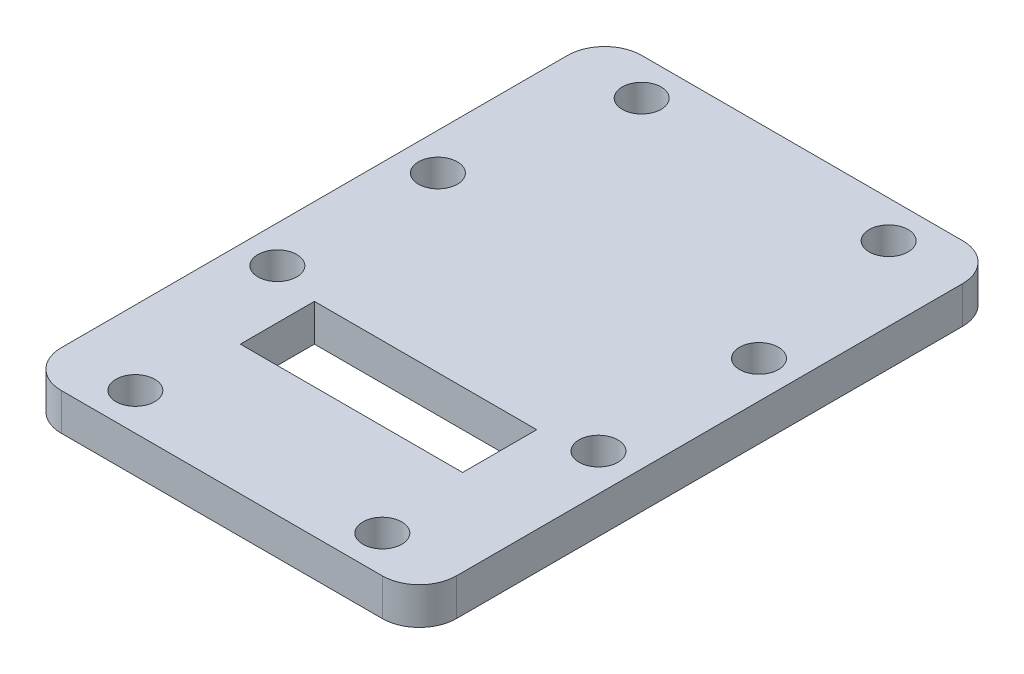
ISO-10303-21;
HEADER;
FILE_DESCRIPTION(('STEP AP214'),'2;1');
FILE_NAME('part.step','',(''),(''),'','','');
FILE_SCHEMA(('AUTOMOTIVE_DESIGN { 1 0 10303 214 1 1 1 1 }'));
ENDSEC;
DATA;
#1=APPLICATION_CONTEXT('core data for automotive mechanical design processes');
#2=APPLICATION_PROTOCOL_DEFINITION('international standard','automotive_design',2000,#1);
#3=PRODUCT_CONTEXT('',#1,'mechanical');
#4=PRODUCT('Part','Part','',(#3));
#5=PRODUCT_RELATED_PRODUCT_CATEGORY('part','',(#4));
#6=PRODUCT_DEFINITION_FORMATION('','',#4);
#7=PRODUCT_DEFINITION_CONTEXT('part definition',#1,'design');
#8=PRODUCT_DEFINITION('design','',#6,#7);
#9=PRODUCT_DEFINITION_SHAPE('','',#8);
#10=(LENGTH_UNIT() NAMED_UNIT(*) SI_UNIT(.MILLI.,.METRE.));
#11=(NAMED_UNIT(*) PLANE_ANGLE_UNIT() SI_UNIT($,.RADIAN.));
#12=(NAMED_UNIT(*) SI_UNIT($,.STERADIAN.) SOLID_ANGLE_UNIT());
#13=UNCERTAINTY_MEASURE_WITH_UNIT(LENGTH_MEASURE(1.E-05),#10,'distance_accuracy_value','');
#14=(GEOMETRIC_REPRESENTATION_CONTEXT(3) GLOBAL_UNCERTAINTY_ASSIGNED_CONTEXT((#13)) GLOBAL_UNIT_ASSIGNED_CONTEXT((#10,
#11,#12)) REPRESENTATION_CONTEXT('',''));
#15=CARTESIAN_POINT('',(0.,0.,0.));
#16=DIRECTION('',(0.,0.,1.));
#17=DIRECTION('',(1.,0.,0.));
#18=AXIS2_PLACEMENT_3D('',#15,#16,#17);
#19=CARTESIAN_POINT('',(-13.,15.,25.5));
#20=DIRECTION('',(0.,1.,0.));
#21=DIRECTION('',(0.,0.,1.));
#22=AXIS2_PLACEMENT_3D('',#19,#20,#21);
#23=PLANE('',#22);
#24=DIRECTION('',(1.,0.,0.));
#25=VECTOR('',#24,1.);
#26=CARTESIAN_POINT('',(-9.00000000000001,15.,18.));
#27=LINE('',#26,#25);
#28=CARTESIAN_POINT('',(-9.00000000000001,15.,18.));
#29=VERTEX_POINT('',#28);
#30=CARTESIAN_POINT('',(9.00000000000001,15.,18.));
#31=VERTEX_POINT('',#30);
#32=EDGE_CURVE('E143',#29,#31,#27,.T.);
#33=ORIENTED_EDGE('',*,*,#32,.F.);
#34=DIRECTION('',(0.,0.,1.));
#35=VECTOR('',#34,1.);
#36=CARTESIAN_POINT('',(-9.00000000000001,15.,12.));
#37=LINE('',#36,#35);
#38=CARTESIAN_POINT('',(-9.00000000000001,15.,12.));
#39=VERTEX_POINT('',#38);
#40=EDGE_CURVE('E127',#39,#29,#37,.T.);
#41=ORIENTED_EDGE('',*,*,#40,.F.);
#42=DIRECTION('',(-1.,0.,0.));
#43=VECTOR('',#42,1.);
#44=CARTESIAN_POINT('',(-9.00000000000001,15.,12.));
#45=LINE('',#44,#43);
#46=CARTESIAN_POINT('',(9.,15.,12.));
#47=VERTEX_POINT('',#46);
#48=EDGE_CURVE('E200',#47,#39,#45,.T.);
#49=ORIENTED_EDGE('',*,*,#48,.F.);
#50=DIRECTION('',(0.,0.,-1.));
#51=VECTOR('',#50,1.);
#52=CARTESIAN_POINT('',(9.,15.,12.));
#53=LINE('',#52,#51);
#54=EDGE_CURVE('E135',#31,#47,#53,.T.);
#55=ORIENTED_EDGE('',*,*,#54,.F.);
#56=EDGE_LOOP('',(#33,#41,#49,#55));
#57=FACE_BOUND('',#56,.T.);
#58=CARTESIAN_POINT('',(13.,15.,11.));
#59=DIRECTION('',(0.,1.,0.));
#60=DIRECTION('',(0.,0.,1.));
#61=AXIS2_PLACEMENT_3D('',#58,#59,#60);
#62=CIRCLE('',#61,1.575);
#63=CARTESIAN_POINT('',(13.,15.,12.575));
#64=VERTEX_POINT('',#63);
#65=EDGE_CURVE('E158',#64,#64,#62,.T.);
#66=ORIENTED_EDGE('',*,*,#65,.F.);
#67=EDGE_LOOP('',(#66));
#68=FACE_BOUND('',#67,.T.);
#69=CARTESIAN_POINT('',(10.,15.,-15.5));
#70=DIRECTION('',(0.,1.,0.));
#71=DIRECTION('',(0.,0.,1.));
#72=AXIS2_PLACEMENT_3D('',#69,#70,#71);
#73=CIRCLE('',#72,1.575);
#74=CARTESIAN_POINT('',(10.,15.,-13.925));
#75=VERTEX_POINT('',#74);
#76=EDGE_CURVE('E170',#75,#75,#73,.T.);
#77=ORIENTED_EDGE('',*,*,#76,.F.);
#78=EDGE_LOOP('',(#77));
#79=FACE_BOUND('',#78,.T.);
#80=CARTESIAN_POINT('',(-13.,15.,-2.));
#81=DIRECTION('',(0.,1.,0.));
#82=DIRECTION('',(0.,0.,1.));
#83=AXIS2_PLACEMENT_3D('',#80,#81,#82);
#84=CIRCLE('',#83,1.575);
#85=CARTESIAN_POINT('',(-13.,15.,-0.425000000000002));
#86=VERTEX_POINT('',#85);
#87=EDGE_CURVE('E182',#86,#86,#84,.T.);
#88=ORIENTED_EDGE('',*,*,#87,.F.);
#89=EDGE_LOOP('',(#88));
#90=FACE_BOUND('',#89,.T.);
#91=CARTESIAN_POINT('',(-10.,15.,25.5));
#92=DIRECTION('',(0.,1.,0.));
#93=DIRECTION('',(0.,0.,1.));
#94=AXIS2_PLACEMENT_3D('',#91,#92,#93);
#95=CIRCLE('',#94,1.575);
#96=CARTESIAN_POINT('',(-10.,15.,27.075));
#97=VERTEX_POINT('',#96);
#98=EDGE_CURVE('E194',#97,#97,#95,.T.);
#99=ORIENTED_EDGE('',*,*,#98,.F.);
#100=EDGE_LOOP('',(#99));
#101=FACE_BOUND('',#100,.T.);
#102=CARTESIAN_POINT('',(-13.,15.,25.5));
#103=DIRECTION('',(0.,1.,0.));
#104=DIRECTION('',(0.,0.,1.));
#105=AXIS2_PLACEMENT_3D('',#102,#103,#104);
#106=CIRCLE('',#105,3.);
#107=CARTESIAN_POINT('',(-16.,15.,25.5));
#108=VERTEX_POINT('',#107);
#109=CARTESIAN_POINT('',(-13.,15.,28.5));
#110=VERTEX_POINT('',#109);
#111=EDGE_CURVE('E211',#108,#110,#106,.T.);
#112=ORIENTED_EDGE('',*,*,#111,.T.);
#113=DIRECTION('',(1.,0.,0.));
#114=VECTOR('',#113,1.);
#115=CARTESIAN_POINT('',(-13.,15.,28.5));
#116=LINE('',#115,#114);
#117=CARTESIAN_POINT('',(13.,15.,28.5));
#118=VERTEX_POINT('',#117);
#119=EDGE_CURVE('E214',#110,#118,#116,.T.);
#120=ORIENTED_EDGE('',*,*,#119,.T.);
#121=CARTESIAN_POINT('',(13.,15.,25.5));
#122=DIRECTION('',(0.,1.,0.));
#123=DIRECTION('',(0.,0.,1.));
#124=AXIS2_PLACEMENT_3D('',#121,#122,#123);
#125=CIRCLE('',#124,3.);
#126=CARTESIAN_POINT('',(16.,15.,25.5));
#127=VERTEX_POINT('',#126);
#128=EDGE_CURVE('E217',#118,#127,#125,.T.);
#129=ORIENTED_EDGE('',*,*,#128,.T.);
#130=DIRECTION('',(0.,0.,-1.));
#131=VECTOR('',#130,1.);
#132=CARTESIAN_POINT('',(16.,15.,25.5));
#133=LINE('',#132,#131);
#134=CARTESIAN_POINT('',(16.,15.,-15.5));
#135=VERTEX_POINT('',#134);
#136=EDGE_CURVE('E219',#127,#135,#133,.T.);
#137=ORIENTED_EDGE('',*,*,#136,.T.);
#138=CARTESIAN_POINT('',(13.,15.,-15.5));
#139=DIRECTION('',(0.,1.,0.));
#140=DIRECTION('',(0.,0.,1.));
#141=AXIS2_PLACEMENT_3D('',#138,#139,#140);
#142=CIRCLE('',#141,3.);
#143=CARTESIAN_POINT('',(13.,15.,-18.5));
#144=VERTEX_POINT('',#143);
#145=EDGE_CURVE('E221',#135,#144,#142,.T.);
#146=ORIENTED_EDGE('',*,*,#145,.T.);
#147=DIRECTION('',(-1.,0.,0.));
#148=VECTOR('',#147,1.);
#149=CARTESIAN_POINT('',(13.,15.,-18.5));
#150=LINE('',#149,#148);
#151=CARTESIAN_POINT('',(-13.,15.,-18.5));
#152=VERTEX_POINT('',#151);
#153=EDGE_CURVE('E223',#144,#152,#150,.T.);
#154=ORIENTED_EDGE('',*,*,#153,.T.);
#155=CARTESIAN_POINT('',(-13.,15.,-15.5));
#156=DIRECTION('',(0.,1.,0.));
#157=DIRECTION('',(0.,0.,1.));
#158=AXIS2_PLACEMENT_3D('',#155,#156,#157);
#159=CIRCLE('',#158,3.);
#160=CARTESIAN_POINT('',(-16.,15.,-15.5));
#161=VERTEX_POINT('',#160);
#162=EDGE_CURVE('E225',#152,#161,#159,.T.);
#163=ORIENTED_EDGE('',*,*,#162,.T.);
#164=DIRECTION('',(0.,0.,1.));
#165=VECTOR('',#164,1.);
#166=CARTESIAN_POINT('',(-16.,15.,-15.5));
#167=LINE('',#166,#165);
#168=EDGE_CURVE('E227',#161,#108,#167,.T.);
#169=ORIENTED_EDGE('',*,*,#168,.T.);
#170=EDGE_LOOP('',(#112,#120,#129,#137,#146,#154,#163,#169));
#171=FACE_BOUND('',#170,.T.);
#172=CARTESIAN_POINT('',(-13.,15.,11.));
#173=DIRECTION('',(0.,1.,0.));
#174=DIRECTION('',(0.,0.,1.));
#175=AXIS2_PLACEMENT_3D('',#172,#173,#174);
#176=CIRCLE('',#175,1.575);
#177=CARTESIAN_POINT('',(-13.,15.,12.575));
#178=VERTEX_POINT('',#177);
#179=EDGE_CURVE('E188',#178,#178,#176,.T.);
#180=ORIENTED_EDGE('',*,*,#179,.F.);
#181=EDGE_LOOP('',(#180));
#182=FACE_BOUND('',#181,.T.);
#183=CARTESIAN_POINT('',(-9.99999999999999,15.,-15.5));
#184=DIRECTION('',(0.,1.,0.));
#185=DIRECTION('',(0.,0.,1.));
#186=AXIS2_PLACEMENT_3D('',#183,#184,#185);
#187=CIRCLE('',#186,1.575);
#188=CARTESIAN_POINT('',(-9.99999999999999,15.,-13.925));
#189=VERTEX_POINT('',#188);
#190=EDGE_CURVE('E176',#189,#189,#187,.T.);
#191=ORIENTED_EDGE('',*,*,#190,.F.);
#192=EDGE_LOOP('',(#191));
#193=FACE_BOUND('',#192,.T.);
#194=CARTESIAN_POINT('',(13.,15.,-2.));
#195=DIRECTION('',(0.,1.,0.));
#196=DIRECTION('',(0.,0.,1.));
#197=AXIS2_PLACEMENT_3D('',#194,#195,#196);
#198=CIRCLE('',#197,1.575);
#199=CARTESIAN_POINT('',(13.,15.,-0.424999999999999));
#200=VERTEX_POINT('',#199);
#201=EDGE_CURVE('E164',#200,#200,#198,.T.);
#202=ORIENTED_EDGE('',*,*,#201,.F.);
#203=EDGE_LOOP('',(#202));
#204=FACE_BOUND('',#203,.T.);
#205=CARTESIAN_POINT('',(10.,15.,25.5));
#206=DIRECTION('',(0.,1.,0.));
#207=DIRECTION('',(0.,0.,1.));
#208=AXIS2_PLACEMENT_3D('',#205,#206,#207);
#209=CIRCLE('',#208,1.575);
#210=CARTESIAN_POINT('',(10.,15.,27.075));
#211=VERTEX_POINT('',#210);
#212=EDGE_CURVE('E152',#211,#211,#209,.T.);
#213=ORIENTED_EDGE('',*,*,#212,.F.);
#214=EDGE_LOOP('',(#213));
#215=FACE_BOUND('',#214,.T.);
#216=ADVANCED_FACE('F39',(#57,#68,#79,#90,#101,#171,#182,#193,#204,#215),#23,.T.);
#217=CARTESIAN_POINT('',(-13.,12.,25.5));
#218=DIRECTION('',(0.,1.,0.));
#219=DIRECTION('',(0.,0.,1.));
#220=AXIS2_PLACEMENT_3D('',#217,#218,#219);
#221=PLANE('',#220);
#222=DIRECTION('',(0.,0.,1.));
#223=VECTOR('',#222,1.);
#224=CARTESIAN_POINT('',(-9.00000000000001,12.,12.));
#225=LINE('',#224,#223);
#226=CARTESIAN_POINT('',(-9.00000000000001,12.,12.));
#227=VERTEX_POINT('',#226);
#228=CARTESIAN_POINT('',(-9.00000000000001,12.,18.));
#229=VERTEX_POINT('',#228);
#230=EDGE_CURVE('E62',#227,#229,#225,.T.);
#231=ORIENTED_EDGE('',*,*,#230,.T.);
#232=DIRECTION('',(1.,0.,0.));
#233=VECTOR('',#232,1.);
#234=CARTESIAN_POINT('',(-13.,12.,18.));
#235=LINE('',#234,#233);
#236=CARTESIAN_POINT('',(9.00000000000001,12.,18.));
#237=VERTEX_POINT('',#236);
#238=EDGE_CURVE('E11',#229,#237,#235,.T.);
#239=ORIENTED_EDGE('',*,*,#238,.T.);
#240=DIRECTION('',(0.,0.,-1.));
#241=VECTOR('',#240,1.);
#242=CARTESIAN_POINT('',(9.,12.,12.));
#243=LINE('',#242,#241);
#244=CARTESIAN_POINT('',(9.,12.,12.));
#245=VERTEX_POINT('',#244);
#246=EDGE_CURVE('E203',#237,#245,#243,.T.);
#247=ORIENTED_EDGE('',*,*,#246,.T.);
#248=DIRECTION('',(-1.,0.,0.));
#249=VECTOR('',#248,1.);
#250=CARTESIAN_POINT('',(-9.00000000000001,12.,12.));
#251=LINE('',#250,#249);
#252=EDGE_CURVE('E136',#245,#227,#251,.T.);
#253=ORIENTED_EDGE('',*,*,#252,.T.);
#254=EDGE_LOOP('',(#231,#239,#247,#253));
#255=FACE_BOUND('',#254,.T.);
#256=CARTESIAN_POINT('',(-13.,12.,25.5));
#257=DIRECTION('',(0.,1.,0.));
#258=DIRECTION('',(0.,0.,1.));
#259=AXIS2_PLACEMENT_3D('',#256,#257,#258);
#260=CIRCLE('',#259,3.);
#261=CARTESIAN_POINT('',(-16.,12.,25.5));
#262=VERTEX_POINT('',#261);
#263=CARTESIAN_POINT('',(-13.,12.,28.5));
#264=VERTEX_POINT('',#263);
#265=EDGE_CURVE('E210',#262,#264,#260,.T.);
#266=ORIENTED_EDGE('',*,*,#265,.F.);
#267=DIRECTION('',(0.,0.,1.));
#268=VECTOR('',#267,1.);
#269=CARTESIAN_POINT('',(-16.,12.,-15.5));
#270=LINE('',#269,#268);
#271=CARTESIAN_POINT('',(-16.,12.,-15.5));
#272=VERTEX_POINT('',#271);
#273=EDGE_CURVE('E215',#272,#262,#270,.T.);
#274=ORIENTED_EDGE('',*,*,#273,.F.);
#275=CARTESIAN_POINT('',(-13.,12.,-15.5));
#276=DIRECTION('',(0.,1.,0.));
#277=DIRECTION('',(0.,0.,1.));
#278=AXIS2_PLACEMENT_3D('',#275,#276,#277);
#279=CIRCLE('',#278,3.);
#280=CARTESIAN_POINT('',(-13.,12.,-18.5));
#281=VERTEX_POINT('',#280);
#282=EDGE_CURVE('E242',#281,#272,#279,.T.);
#283=ORIENTED_EDGE('',*,*,#282,.F.);
#284=DIRECTION('',(-1.,0.,0.));
#285=VECTOR('',#284,1.);
#286=CARTESIAN_POINT('',(13.,12.,-18.5));
#287=LINE('',#286,#285);
#288=CARTESIAN_POINT('',(13.,12.,-18.5));
#289=VERTEX_POINT('',#288);
#290=EDGE_CURVE('E240',#289,#281,#287,.T.);
#291=ORIENTED_EDGE('',*,*,#290,.F.);
#292=CARTESIAN_POINT('',(13.,12.,-15.5));
#293=DIRECTION('',(0.,1.,0.));
#294=DIRECTION('',(0.,0.,1.));
#295=AXIS2_PLACEMENT_3D('',#292,#293,#294);
#296=CIRCLE('',#295,3.);
#297=CARTESIAN_POINT('',(16.,12.,-15.5));
#298=VERTEX_POINT('',#297);
#299=EDGE_CURVE('E238',#298,#289,#296,.T.);
#300=ORIENTED_EDGE('',*,*,#299,.F.);
#301=DIRECTION('',(0.,0.,-1.));
#302=VECTOR('',#301,1.);
#303=CARTESIAN_POINT('',(16.,12.,25.5));
#304=LINE('',#303,#302);
#305=CARTESIAN_POINT('',(16.,12.,25.5));
#306=VERTEX_POINT('',#305);
#307=EDGE_CURVE('E236',#306,#298,#304,.T.);
#308=ORIENTED_EDGE('',*,*,#307,.F.);
#309=CARTESIAN_POINT('',(13.,12.,25.5));
#310=DIRECTION('',(0.,1.,0.));
#311=DIRECTION('',(0.,0.,1.));
#312=AXIS2_PLACEMENT_3D('',#309,#310,#311);
#313=CIRCLE('',#312,3.);
#314=CARTESIAN_POINT('',(13.,12.,28.5));
#315=VERTEX_POINT('',#314);
#316=EDGE_CURVE('E234',#315,#306,#313,.T.);
#317=ORIENTED_EDGE('',*,*,#316,.F.);
#318=DIRECTION('',(1.,0.,0.));
#319=VECTOR('',#318,1.);
#320=CARTESIAN_POINT('',(-13.,12.,28.5));
#321=LINE('',#320,#319);
#322=EDGE_CURVE('E232',#264,#315,#321,.T.);
#323=ORIENTED_EDGE('',*,*,#322,.F.);
#324=EDGE_LOOP('',(#266,#274,#283,#291,#300,#308,#317,#323));
#325=FACE_BOUND('',#324,.T.);
#326=CARTESIAN_POINT('',(-10.,12.,25.5));
#327=DIRECTION('',(0.,1.,0.));
#328=DIRECTION('',(0.,0.,1.));
#329=AXIS2_PLACEMENT_3D('',#326,#327,#328);
#330=CIRCLE('',#329,1.575);
#331=CARTESIAN_POINT('',(-10.,12.,27.075));
#332=VERTEX_POINT('',#331);
#333=EDGE_CURVE('E191',#332,#332,#330,.T.);
#334=ORIENTED_EDGE('',*,*,#333,.T.);
#335=EDGE_LOOP('',(#334));
#336=FACE_BOUND('',#335,.T.);
#337=CARTESIAN_POINT('',(-13.,12.,11.));
#338=DIRECTION('',(0.,1.,0.));
#339=DIRECTION('',(0.,0.,1.));
#340=AXIS2_PLACEMENT_3D('',#337,#338,#339);
#341=CIRCLE('',#340,1.575);
#342=CARTESIAN_POINT('',(-13.,12.,12.575));
#343=VERTEX_POINT('',#342);
#344=EDGE_CURVE('E185',#343,#343,#341,.T.);
#345=ORIENTED_EDGE('',*,*,#344,.T.);
#346=EDGE_LOOP('',(#345));
#347=FACE_BOUND('',#346,.T.);
#348=CARTESIAN_POINT('',(-13.,12.,-2.));
#349=DIRECTION('',(0.,1.,0.));
#350=DIRECTION('',(0.,0.,1.));
#351=AXIS2_PLACEMENT_3D('',#348,#349,#350);
#352=CIRCLE('',#351,1.575);
#353=CARTESIAN_POINT('',(-13.,12.,-0.425000000000002));
#354=VERTEX_POINT('',#353);
#355=EDGE_CURVE('E179',#354,#354,#352,.T.);
#356=ORIENTED_EDGE('',*,*,#355,.T.);
#357=EDGE_LOOP('',(#356));
#358=FACE_BOUND('',#357,.T.);
#359=CARTESIAN_POINT('',(-9.99999999999999,12.,-15.5));
#360=DIRECTION('',(0.,1.,0.));
#361=DIRECTION('',(0.,0.,1.));
#362=AXIS2_PLACEMENT_3D('',#359,#360,#361);
#363=CIRCLE('',#362,1.575);
#364=CARTESIAN_POINT('',(-9.99999999999999,12.,-13.925));
#365=VERTEX_POINT('',#364);
#366=EDGE_CURVE('E173',#365,#365,#363,.T.);
#367=ORIENTED_EDGE('',*,*,#366,.T.);
#368=EDGE_LOOP('',(#367));
#369=FACE_BOUND('',#368,.T.);
#370=CARTESIAN_POINT('',(10.,12.,-15.5));
#371=DIRECTION('',(0.,1.,0.));
#372=DIRECTION('',(0.,0.,1.));
#373=AXIS2_PLACEMENT_3D('',#370,#371,#372);
#374=CIRCLE('',#373,1.575);
#375=CARTESIAN_POINT('',(10.,12.,-13.925));
#376=VERTEX_POINT('',#375);
#377=EDGE_CURVE('E167',#376,#376,#374,.T.);
#378=ORIENTED_EDGE('',*,*,#377,.T.);
#379=EDGE_LOOP('',(#378));
#380=FACE_BOUND('',#379,.T.);
#381=CARTESIAN_POINT('',(13.,12.,-2.));
#382=DIRECTION('',(0.,1.,0.));
#383=DIRECTION('',(0.,0.,1.));
#384=AXIS2_PLACEMENT_3D('',#381,#382,#383);
#385=CIRCLE('',#384,1.575);
#386=CARTESIAN_POINT('',(13.,12.,-0.424999999999999));
#387=VERTEX_POINT('',#386);
#388=EDGE_CURVE('E161',#387,#387,#385,.T.);
#389=ORIENTED_EDGE('',*,*,#388,.T.);
#390=EDGE_LOOP('',(#389));
#391=FACE_BOUND('',#390,.T.);
#392=CARTESIAN_POINT('',(13.,12.,11.));
#393=DIRECTION('',(0.,1.,0.));
#394=DIRECTION('',(0.,0.,1.));
#395=AXIS2_PLACEMENT_3D('',#392,#393,#394);
#396=CIRCLE('',#395,1.575);
#397=CARTESIAN_POINT('',(13.,12.,12.575));
#398=VERTEX_POINT('',#397);
#399=EDGE_CURVE('E155',#398,#398,#396,.T.);
#400=ORIENTED_EDGE('',*,*,#399,.T.);
#401=EDGE_LOOP('',(#400));
#402=FACE_BOUND('',#401,.T.);
#403=CARTESIAN_POINT('',(10.,12.,25.5));
#404=DIRECTION('',(0.,1.,0.));
#405=DIRECTION('',(0.,0.,1.));
#406=AXIS2_PLACEMENT_3D('',#403,#404,#405);
#407=CIRCLE('',#406,1.575);
#408=CARTESIAN_POINT('',(10.,12.,27.075));
#409=VERTEX_POINT('',#408);
#410=EDGE_CURVE('E150',#409,#409,#407,.T.);
#411=ORIENTED_EDGE('',*,*,#410,.T.);
#412=EDGE_LOOP('',(#411));
#413=FACE_BOUND('',#412,.T.);
#414=ADVANCED_FACE('F275',(#255,#325,#336,#347,#358,#369,#380,#391,#402,#413),#221,.F.);
#415=CARTESIAN_POINT('',(-13.,15.,25.5));
#416=DIRECTION('',(0.,-1.,0.));
#417=DIRECTION('',(0.,0.,-1.));
#418=AXIS2_PLACEMENT_3D('',#415,#416,#417);
#419=CYLINDRICAL_SURFACE('',#418,3.);
#420=ORIENTED_EDGE('',*,*,#265,.T.);
#421=DIRECTION('',(0.,-1.,0.));
#422=VECTOR('',#421,1.);
#423=CARTESIAN_POINT('',(-13.,15.,28.5));
#424=LINE('',#423,#422);
#425=EDGE_CURVE('E47',#110,#264,#424,.T.);
#426=ORIENTED_EDGE('',*,*,#425,.F.);
#427=ORIENTED_EDGE('',*,*,#111,.F.);
#428=DIRECTION('',(0.,-1.,0.));
#429=VECTOR('',#428,1.);
#430=CARTESIAN_POINT('',(-16.,15.,25.5));
#431=LINE('',#430,#429);
#432=EDGE_CURVE('E229',#108,#262,#431,.T.);
#433=ORIENTED_EDGE('',*,*,#432,.T.);
#434=EDGE_LOOP('',(#420,#426,#427,#433));
#435=FACE_BOUND('',#434,.T.);
#436=ADVANCED_FACE('F41',(#435),#419,.T.);
#437=CARTESIAN_POINT('',(-13.,15.,28.5));
#438=DIRECTION('',(0.,0.,-1.));
#439=DIRECTION('',(-1.,0.,0.));
#440=AXIS2_PLACEMENT_3D('',#437,#438,#439);
#441=PLANE('',#440);
#442=ORIENTED_EDGE('',*,*,#322,.T.);
#443=DIRECTION('',(0.,-1.,0.));
#444=VECTOR('',#443,1.);
#445=CARTESIAN_POINT('',(13.,15.,28.5));
#446=LINE('',#445,#444);
#447=EDGE_CURVE('E262',#118,#315,#446,.T.);
#448=ORIENTED_EDGE('',*,*,#447,.F.);
#449=ORIENTED_EDGE('',*,*,#119,.F.);
#450=ORIENTED_EDGE('',*,*,#425,.T.);
#451=EDGE_LOOP('',(#442,#448,#449,#450));
#452=FACE_BOUND('',#451,.T.);
#453=ADVANCED_FACE('F267',(#452),#441,.F.);
#454=CARTESIAN_POINT('',(13.,15.,25.5));
#455=DIRECTION('',(0.,-1.,0.));
#456=DIRECTION('',(0.,0.,-1.));
#457=AXIS2_PLACEMENT_3D('',#454,#455,#456);
#458=CYLINDRICAL_SURFACE('',#457,3.);
#459=ORIENTED_EDGE('',*,*,#316,.T.);
#460=DIRECTION('',(0.,-1.,0.));
#461=VECTOR('',#460,1.);
#462=CARTESIAN_POINT('',(16.,15.,25.5));
#463=LINE('',#462,#461);
#464=EDGE_CURVE('E259',#127,#306,#463,.T.);
#465=ORIENTED_EDGE('',*,*,#464,.F.);
#466=ORIENTED_EDGE('',*,*,#128,.F.);
#467=ORIENTED_EDGE('',*,*,#447,.T.);
#468=EDGE_LOOP('',(#459,#465,#466,#467));
#469=FACE_BOUND('',#468,.T.);
#470=ADVANCED_FACE('F283',(#469),#458,.T.);
#471=CARTESIAN_POINT('',(16.,15.,25.5));
#472=DIRECTION('',(-1.,0.,0.));
#473=DIRECTION('',(0.,0.,1.));
#474=AXIS2_PLACEMENT_3D('',#471,#472,#473);
#475=PLANE('',#474);
#476=ORIENTED_EDGE('',*,*,#307,.T.);
#477=DIRECTION('',(0.,-1.,0.));
#478=VECTOR('',#477,1.);
#479=CARTESIAN_POINT('',(16.,15.,-15.5));
#480=LINE('',#479,#478);
#481=EDGE_CURVE('E256',#135,#298,#480,.T.);
#482=ORIENTED_EDGE('',*,*,#481,.F.);
#483=ORIENTED_EDGE('',*,*,#136,.F.);
#484=ORIENTED_EDGE('',*,*,#464,.T.);
#485=EDGE_LOOP('',(#476,#482,#483,#484));
#486=FACE_BOUND('',#485,.T.);
#487=ADVANCED_FACE('F287',(#486),#475,.F.);
#488=CARTESIAN_POINT('',(13.,15.,-15.5));
#489=DIRECTION('',(0.,-1.,0.));
#490=DIRECTION('',(0.,0.,-1.));
#491=AXIS2_PLACEMENT_3D('',#488,#489,#490);
#492=CYLINDRICAL_SURFACE('',#491,3.);
#493=ORIENTED_EDGE('',*,*,#299,.T.);
#494=DIRECTION('',(0.,-1.,0.));
#495=VECTOR('',#494,1.);
#496=CARTESIAN_POINT('',(13.,15.,-18.5));
#497=LINE('',#496,#495);
#498=EDGE_CURVE('E253',#144,#289,#497,.T.);
#499=ORIENTED_EDGE('',*,*,#498,.F.);
#500=ORIENTED_EDGE('',*,*,#145,.F.);
#501=ORIENTED_EDGE('',*,*,#481,.T.);
#502=EDGE_LOOP('',(#493,#499,#500,#501));
#503=FACE_BOUND('',#502,.T.);
#504=ADVANCED_FACE('F306',(#503),#492,.T.);
#505=CARTESIAN_POINT('',(13.,15.,-18.5));
#506=DIRECTION('',(0.,0.,1.));
#507=DIRECTION('',(1.,0.,0.));
#508=AXIS2_PLACEMENT_3D('',#505,#506,#507);
#509=PLANE('',#508);
#510=ORIENTED_EDGE('',*,*,#290,.T.);
#511=DIRECTION('',(0.,-1.,0.));
#512=VECTOR('',#511,1.);
#513=CARTESIAN_POINT('',(-13.,15.,-18.5));
#514=LINE('',#513,#512);
#515=EDGE_CURVE('E250',#152,#281,#514,.T.);
#516=ORIENTED_EDGE('',*,*,#515,.F.);
#517=ORIENTED_EDGE('',*,*,#153,.F.);
#518=ORIENTED_EDGE('',*,*,#498,.T.);
#519=EDGE_LOOP('',(#510,#516,#517,#518));
#520=FACE_BOUND('',#519,.T.);
#521=ADVANCED_FACE('F303',(#520),#509,.F.);
#522=CARTESIAN_POINT('',(-13.,15.,-15.5));
#523=DIRECTION('',(0.,-1.,0.));
#524=DIRECTION('',(0.,0.,-1.));
#525=AXIS2_PLACEMENT_3D('',#522,#523,#524);
#526=CYLINDRICAL_SURFACE('',#525,3.);
#527=ORIENTED_EDGE('',*,*,#282,.T.);
#528=DIRECTION('',(0.,-1.,0.));
#529=VECTOR('',#528,1.);
#530=CARTESIAN_POINT('',(-16.,15.,-15.5));
#531=LINE('',#530,#529);
#532=EDGE_CURVE('E247',#161,#272,#531,.T.);
#533=ORIENTED_EDGE('',*,*,#532,.F.);
#534=ORIENTED_EDGE('',*,*,#162,.F.);
#535=ORIENTED_EDGE('',*,*,#515,.T.);
#536=EDGE_LOOP('',(#527,#533,#534,#535));
#537=FACE_BOUND('',#536,.T.);
#538=ADVANCED_FACE('F299',(#537),#526,.T.);
#539=CARTESIAN_POINT('',(-16.,15.,-15.5));
#540=DIRECTION('',(1.,0.,0.));
#541=DIRECTION('',(0.,0.,-1.));
#542=AXIS2_PLACEMENT_3D('',#539,#540,#541);
#543=PLANE('',#542);
#544=ORIENTED_EDGE('',*,*,#273,.T.);
#545=ORIENTED_EDGE('',*,*,#432,.F.);
#546=ORIENTED_EDGE('',*,*,#168,.F.);
#547=ORIENTED_EDGE('',*,*,#532,.T.);
#548=EDGE_LOOP('',(#544,#545,#546,#547));
#549=FACE_BOUND('',#548,.T.);
#550=ADVANCED_FACE('F297',(#549),#543,.F.);
#551=CARTESIAN_POINT('',(-9.00000000000001,15.,12.));
#552=DIRECTION('',(1.,0.,0.));
#553=DIRECTION('',(0.,0.,-1.));
#554=AXIS2_PLACEMENT_3D('',#551,#552,#553);
#555=PLANE('',#554);
#556=ORIENTED_EDGE('',*,*,#230,.F.);
#557=DIRECTION('',(0.,-1.,0.));
#558=VECTOR('',#557,1.);
#559=CARTESIAN_POINT('',(-9.00000000000001,15.,12.));
#560=LINE('',#559,#558);
#561=EDGE_CURVE('E131',#39,#227,#560,.T.);
#562=ORIENTED_EDGE('',*,*,#561,.F.);
#563=ORIENTED_EDGE('',*,*,#40,.T.);
#564=DIRECTION('',(0.,1.,0.));
#565=VECTOR('',#564,1.);
#566=CARTESIAN_POINT('',(-9.00000000000001,10.,18.));
#567=LINE('',#566,#565);
#568=EDGE_CURVE('E130',#229,#29,#567,.T.);
#569=ORIENTED_EDGE('',*,*,#568,.F.);
#570=EDGE_LOOP('',(#556,#562,#563,#569));
#571=FACE_BOUND('',#570,.T.);
#572=ADVANCED_FACE('F129',(#571),#555,.T.);
#573=CARTESIAN_POINT('',(9.,15.,12.));
#574=DIRECTION('',(-1.,0.,0.));
#575=DIRECTION('',(0.,0.,1.));
#576=AXIS2_PLACEMENT_3D('',#573,#574,#575);
#577=PLANE('',#576);
#578=ORIENTED_EDGE('',*,*,#246,.F.);
#579=DIRECTION('',(0.,1.,0.));
#580=VECTOR('',#579,1.);
#581=CARTESIAN_POINT('',(9.00000000000001,10.,18.));
#582=LINE('',#581,#580);
#583=EDGE_CURVE('E144',#237,#31,#582,.T.);
#584=ORIENTED_EDGE('',*,*,#583,.T.);
#585=ORIENTED_EDGE('',*,*,#54,.T.);
#586=DIRECTION('',(0.,-1.,0.));
#587=VECTOR('',#586,1.);
#588=CARTESIAN_POINT('',(9.,15.,12.));
#589=LINE('',#588,#587);
#590=EDGE_CURVE('E54',#47,#245,#589,.T.);
#591=ORIENTED_EDGE('',*,*,#590,.T.);
#592=EDGE_LOOP('',(#578,#584,#585,#591));
#593=FACE_BOUND('',#592,.T.);
#594=ADVANCED_FACE('F349',(#593),#577,.T.);
#595=CARTESIAN_POINT('',(-9.00000000000001,15.,12.));
#596=DIRECTION('',(0.,0.,1.));
#597=DIRECTION('',(1.,0.,0.));
#598=AXIS2_PLACEMENT_3D('',#595,#596,#597);
#599=PLANE('',#598);
#600=ORIENTED_EDGE('',*,*,#252,.F.);
#601=ORIENTED_EDGE('',*,*,#590,.F.);
#602=ORIENTED_EDGE('',*,*,#48,.T.);
#603=ORIENTED_EDGE('',*,*,#561,.T.);
#604=EDGE_LOOP('',(#600,#601,#602,#603));
#605=FACE_BOUND('',#604,.T.);
#606=ADVANCED_FACE('F359',(#605),#599,.T.);
#607=CARTESIAN_POINT('',(-10.,15.,25.5));
#608=DIRECTION('',(0.,-1.,0.));
#609=DIRECTION('',(0.,0.,-1.));
#610=AXIS2_PLACEMENT_3D('',#607,#608,#609);
#611=CYLINDRICAL_SURFACE('',#610,1.575);
#612=ORIENTED_EDGE('',*,*,#98,.T.);
#613=EDGE_LOOP('',(#612));
#614=FACE_BOUND('',#613,.T.);
#615=ORIENTED_EDGE('',*,*,#333,.F.);
#616=EDGE_LOOP('',(#615));
#617=FACE_BOUND('',#616,.T.);
#618=ADVANCED_FACE('F370',(#614,#617),#611,.F.);
#619=CARTESIAN_POINT('',(-13.,15.,11.));
#620=DIRECTION('',(0.,-1.,0.));
#621=DIRECTION('',(0.,0.,-1.));
#622=AXIS2_PLACEMENT_3D('',#619,#620,#621);
#623=CYLINDRICAL_SURFACE('',#622,1.575);
#624=ORIENTED_EDGE('',*,*,#179,.T.);
#625=EDGE_LOOP('',(#624));
#626=FACE_BOUND('',#625,.T.);
#627=ORIENTED_EDGE('',*,*,#344,.F.);
#628=EDGE_LOOP('',(#627));
#629=FACE_BOUND('',#628,.T.);
#630=ADVANCED_FACE('F378',(#626,#629),#623,.F.);
#631=CARTESIAN_POINT('',(-13.,15.,-2.));
#632=DIRECTION('',(0.,-1.,0.));
#633=DIRECTION('',(0.,0.,-1.));
#634=AXIS2_PLACEMENT_3D('',#631,#632,#633);
#635=CYLINDRICAL_SURFACE('',#634,1.575);
#636=ORIENTED_EDGE('',*,*,#87,.T.);
#637=EDGE_LOOP('',(#636));
#638=FACE_BOUND('',#637,.T.);
#639=ORIENTED_EDGE('',*,*,#355,.F.);
#640=EDGE_LOOP('',(#639));
#641=FACE_BOUND('',#640,.T.);
#642=ADVANCED_FACE('F387',(#638,#641),#635,.F.);
#643=CARTESIAN_POINT('',(-9.99999999999999,15.,-15.5));
#644=DIRECTION('',(0.,-1.,0.));
#645=DIRECTION('',(0.,0.,-1.));
#646=AXIS2_PLACEMENT_3D('',#643,#644,#645);
#647=CYLINDRICAL_SURFACE('',#646,1.575);
#648=ORIENTED_EDGE('',*,*,#190,.T.);
#649=EDGE_LOOP('',(#648));
#650=FACE_BOUND('',#649,.T.);
#651=ORIENTED_EDGE('',*,*,#366,.F.);
#652=EDGE_LOOP('',(#651));
#653=FACE_BOUND('',#652,.T.);
#654=ADVANCED_FACE('F396',(#650,#653),#647,.F.);
#655=CARTESIAN_POINT('',(10.,15.,-15.5));
#656=DIRECTION('',(0.,-1.,0.));
#657=DIRECTION('',(0.,0.,-1.));
#658=AXIS2_PLACEMENT_3D('',#655,#656,#657);
#659=CYLINDRICAL_SURFACE('',#658,1.575);
#660=ORIENTED_EDGE('',*,*,#76,.T.);
#661=EDGE_LOOP('',(#660));
#662=FACE_BOUND('',#661,.T.);
#663=ORIENTED_EDGE('',*,*,#377,.F.);
#664=EDGE_LOOP('',(#663));
#665=FACE_BOUND('',#664,.T.);
#666=ADVANCED_FACE('F405',(#662,#665),#659,.F.);
#667=CARTESIAN_POINT('',(13.,15.,-2.));
#668=DIRECTION('',(0.,-1.,0.));
#669=DIRECTION('',(0.,0.,-1.));
#670=AXIS2_PLACEMENT_3D('',#667,#668,#669);
#671=CYLINDRICAL_SURFACE('',#670,1.575);
#672=ORIENTED_EDGE('',*,*,#201,.T.);
#673=EDGE_LOOP('',(#672));
#674=FACE_BOUND('',#673,.T.);
#675=ORIENTED_EDGE('',*,*,#388,.F.);
#676=EDGE_LOOP('',(#675));
#677=FACE_BOUND('',#676,.T.);
#678=ADVANCED_FACE('F414',(#674,#677),#671,.F.);
#679=CARTESIAN_POINT('',(13.,15.,11.));
#680=DIRECTION('',(0.,-1.,0.));
#681=DIRECTION('',(0.,0.,-1.));
#682=AXIS2_PLACEMENT_3D('',#679,#680,#681);
#683=CYLINDRICAL_SURFACE('',#682,1.575);
#684=ORIENTED_EDGE('',*,*,#65,.T.);
#685=EDGE_LOOP('',(#684));
#686=FACE_BOUND('',#685,.T.);
#687=ORIENTED_EDGE('',*,*,#399,.F.);
#688=EDGE_LOOP('',(#687));
#689=FACE_BOUND('',#688,.T.);
#690=ADVANCED_FACE('F423',(#686,#689),#683,.F.);
#691=CARTESIAN_POINT('',(10.,15.,25.5));
#692=DIRECTION('',(0.,-1.,0.));
#693=DIRECTION('',(0.,0.,-1.));
#694=AXIS2_PLACEMENT_3D('',#691,#692,#693);
#695=CYLINDRICAL_SURFACE('',#694,1.575);
#696=ORIENTED_EDGE('',*,*,#212,.T.);
#697=EDGE_LOOP('',(#696));
#698=FACE_BOUND('',#697,.T.);
#699=ORIENTED_EDGE('',*,*,#410,.F.);
#700=EDGE_LOOP('',(#699));
#701=FACE_BOUND('',#700,.T.);
#702=ADVANCED_FACE('F432',(#698,#701),#695,.F.);
#703=CARTESIAN_POINT('',(-9.00000000000001,10.,18.));
#704=DIRECTION('',(0.,0.,1.));
#705=DIRECTION('',(1.,0.,0.));
#706=AXIS2_PLACEMENT_3D('',#703,#704,#705);
#707=PLANE('',#706);
#708=ORIENTED_EDGE('',*,*,#568,.T.);
#709=ORIENTED_EDGE('',*,*,#32,.T.);
#710=ORIENTED_EDGE('',*,*,#583,.F.);
#711=ORIENTED_EDGE('',*,*,#238,.F.);
#712=EDGE_LOOP('',(#708,#709,#710,#711));
#713=FACE_BOUND('',#712,.T.);
#714=ADVANCED_FACE('F141',(#713),#707,.F.);
#715=CLOSED_SHELL('',(#216,#414,#436,#453,#470,#487,#504,#521,#538,#550,#572,#594,#606,#618,
#630,#642,#654,#666,#678,#690,#702,#714));
#716=MANIFOLD_SOLID_BREP('B2',#715);
#717=ADVANCED_BREP_SHAPE_REPRESENTATION('',(#18,#716),#14);
#718=SHAPE_DEFINITION_REPRESENTATION(#9,#717);
ENDSEC;
END-ISO-10303-21;
